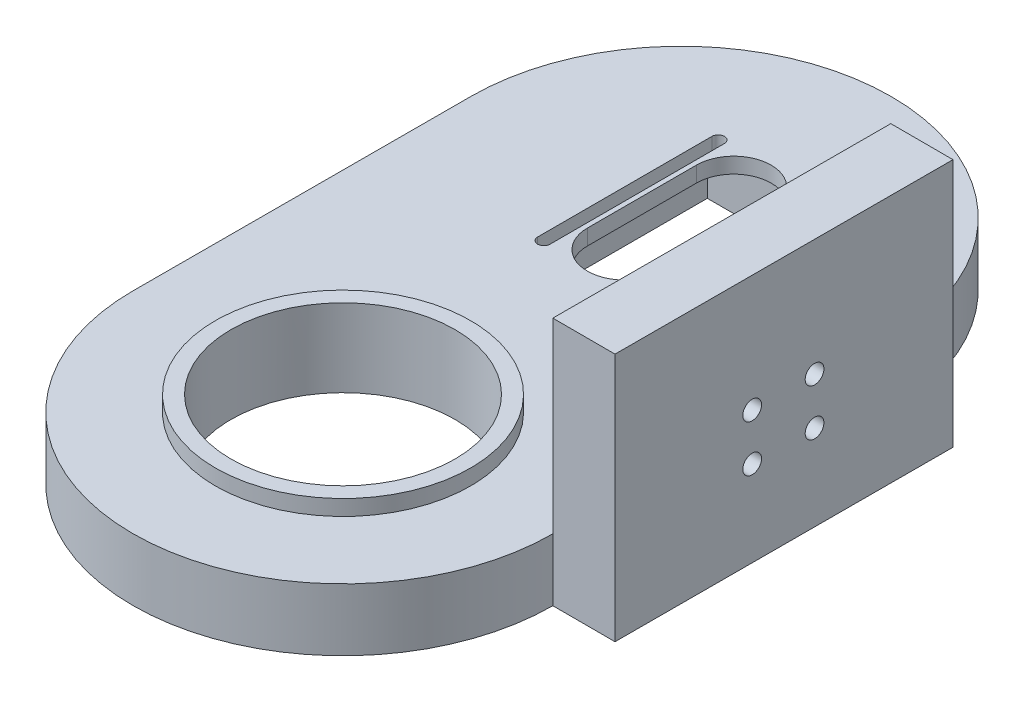
ISO-10303-21;
HEADER;
FILE_DESCRIPTION(('STEP AP214'),'2;1');
FILE_NAME('part.step','',(''),(''),'','','');
FILE_SCHEMA(('AUTOMOTIVE_DESIGN { 1 0 10303 214 1 1 1 1 }'));
ENDSEC;
DATA;
#1=APPLICATION_CONTEXT('core data for automotive mechanical design processes');
#2=APPLICATION_PROTOCOL_DEFINITION('international standard','automotive_design',2000,#1);
#3=PRODUCT_CONTEXT('',#1,'mechanical');
#4=PRODUCT('Part','Part','',(#3));
#5=PRODUCT_RELATED_PRODUCT_CATEGORY('part','',(#4));
#6=PRODUCT_DEFINITION_FORMATION('','',#4);
#7=PRODUCT_DEFINITION_CONTEXT('part definition',#1,'design');
#8=PRODUCT_DEFINITION('design','',#6,#7);
#9=PRODUCT_DEFINITION_SHAPE('','',#8);
#10=(LENGTH_UNIT() NAMED_UNIT(*) SI_UNIT(.MILLI.,.METRE.));
#11=(NAMED_UNIT(*) PLANE_ANGLE_UNIT() SI_UNIT($,.RADIAN.));
#12=(NAMED_UNIT(*) SI_UNIT($,.STERADIAN.) SOLID_ANGLE_UNIT());
#13=UNCERTAINTY_MEASURE_WITH_UNIT(LENGTH_MEASURE(1.E-05),#10,'distance_accuracy_value','');
#14=(GEOMETRIC_REPRESENTATION_CONTEXT(3) GLOBAL_UNCERTAINTY_ASSIGNED_CONTEXT((#13)) GLOBAL_UNIT_ASSIGNED_CONTEXT((#10,
#11,#12)) REPRESENTATION_CONTEXT('',''));
#15=CARTESIAN_POINT('',(0.,0.,0.));
#16=DIRECTION('',(0.,0.,1.));
#17=DIRECTION('',(1.,0.,0.));
#18=AXIS2_PLACEMENT_3D('',#15,#16,#17);
#19=CARTESIAN_POINT('',(0.,20.,0.));
#20=DIRECTION('',(0.,1.,0.));
#21=DIRECTION('',(0.,0.,1.));
#22=AXIS2_PLACEMENT_3D('',#19,#20,#21);
#23=PLANE('',#22);
#24=DIRECTION('',(-0.00171134802945728,0.,0.999998535642889));
#25=VECTOR('',#24,1.);
#26=CARTESIAN_POINT('',(-87.4219763603428,20.,-0.149609646057483));
#27=LINE('',#26,#25);
#28=CARTESIAN_POINT('',(-87.314456968046,20.,-62.9768271373472));
#29=VERTEX_POINT('',#28);
#30=CARTESIAN_POINT('',(-87.4999011558999,20.,45.3844840076296));
#31=VERTEX_POINT('',#30);
#32=EDGE_CURVE('E345',#29,#31,#27,.T.);
#33=ORIENTED_EDGE('',*,*,#32,.T.);
#34=CARTESIAN_POINT('',(-20.0000000000049,20.,45.4999999996179));
#35=DIRECTION('',(0.,1.,0.));
#36=DIRECTION('',(0.,0.,1.));
#37=AXIS2_PLACEMENT_3D('',#34,#35,#36);
#38=CIRCLE('',#37,67.5);
#39=CARTESIAN_POINT('',(47.4999011558901,20.,45.6155159916063));
#40=VERTEX_POINT('',#39);
#41=EDGE_CURVE('E348',#31,#40,#38,.T.);
#42=ORIENTED_EDGE('',*,*,#41,.T.);
#43=DIRECTION('',(0.00171134802945721,0.,-0.999998535642889));
#44=VECTOR('',#43,1.);
#45=CARTESIAN_POINT('',(47.5778259514472,20.,0.0814223379192467));
#46=LINE('',#45,#44);
#47=CARTESIAN_POINT('',(47.6853453437439,20.,-62.7457951533704));
#48=VERTEX_POINT('',#47);
#49=EDGE_CURVE('E351',#40,#48,#46,.T.);
#50=ORIENTED_EDGE('',*,*,#49,.T.);
#51=CARTESIAN_POINT('',(-19.814555812151,20.,-62.8613111453587));
#52=DIRECTION('',(0.,1.,0.));
#53=DIRECTION('',(0.,0.,1.));
#54=AXIS2_PLACEMENT_3D('',#51,#52,#53);
#55=CIRCLE('',#54,67.5);
#56=EDGE_CURVE('E353',#48,#29,#55,.T.);
#57=ORIENTED_EDGE('',*,*,#56,.T.);
#58=EDGE_LOOP('',(#33,#42,#50,#57));
#59=FACE_BOUND('',#58,.T.);
#60=CARTESIAN_POINT('',(-4.5,20.,-90.5));
#61=DIRECTION('',(0.,1.,0.));
#62=DIRECTION('',(0.,0.,1.));
#63=AXIS2_PLACEMENT_3D('',#60,#61,#62);
#64=CIRCLE('',#63,1.99999999999997);
#65=CARTESIAN_POINT('',(-2.50000000000003,20.,-90.5));
#66=VERTEX_POINT('',#65);
#67=CARTESIAN_POINT('',(-6.49999999999998,20.,-90.5));
#68=VERTEX_POINT('',#67);
#69=EDGE_CURVE('E378',#66,#68,#64,.T.);
#70=ORIENTED_EDGE('',*,*,#69,.F.);
#71=DIRECTION('',(0.,0.,1.));
#72=VECTOR('',#71,1.);
#73=CARTESIAN_POINT('',(-2.50000000000003,20.,0.));
#74=LINE('',#73,#72);
#75=CARTESIAN_POINT('',(-2.50000000000003,20.,-34.5));
#76=VERTEX_POINT('',#75);
#77=EDGE_CURVE('E370',#66,#76,#74,.T.);
#78=ORIENTED_EDGE('',*,*,#77,.T.);
#79=CARTESIAN_POINT('',(-4.5,20.,-34.5));
#80=DIRECTION('',(0.,1.,0.));
#81=DIRECTION('',(0.,0.,1.));
#82=AXIS2_PLACEMENT_3D('',#79,#80,#81);
#83=CIRCLE('',#82,1.99999999999997);
#84=CARTESIAN_POINT('',(-6.49999999999998,20.,-34.5));
#85=VERTEX_POINT('',#84);
#86=EDGE_CURVE('E373',#85,#76,#83,.T.);
#87=ORIENTED_EDGE('',*,*,#86,.F.);
#88=DIRECTION('',(0.,0.,1.));
#89=VECTOR('',#88,1.);
#90=CARTESIAN_POINT('',(-6.49999999999998,20.,0.));
#91=LINE('',#90,#89);
#92=EDGE_CURVE('E376',#68,#85,#91,.T.);
#93=ORIENTED_EDGE('',*,*,#92,.F.);
#94=EDGE_LOOP('',(#70,#78,#87,#93));
#95=FACE_BOUND('',#94,.T.);
#96=DIRECTION('',(0.,0.,1.));
#97=VECTOR('',#96,1.);
#98=CARTESIAN_POINT('',(-32.,20.,0.));
#99=LINE('',#98,#97);
#100=CARTESIAN_POINT('',(-32.,20.,-80.));
#101=VERTEX_POINT('',#100);
#102=CARTESIAN_POINT('',(-32.,20.,-45.));
#103=VERTEX_POINT('',#102);
#104=EDGE_CURVE('E387',#101,#103,#99,.T.);
#105=ORIENTED_EDGE('',*,*,#104,.F.);
#106=CARTESIAN_POINT('',(-20.,20.,-80.));
#107=DIRECTION('',(0.,1.,0.));
#108=DIRECTION('',(0.,0.,1.));
#109=AXIS2_PLACEMENT_3D('',#106,#107,#108);
#110=CIRCLE('',#109,12.);
#111=CARTESIAN_POINT('',(-8.00000000000001,20.,-80.));
#112=VERTEX_POINT('',#111);
#113=EDGE_CURVE('E380',#112,#101,#110,.T.);
#114=ORIENTED_EDGE('',*,*,#113,.F.);
#115=DIRECTION('',(0.,0.,1.));
#116=VECTOR('',#115,1.);
#117=CARTESIAN_POINT('',(-8.00000000000001,20.,0.));
#118=LINE('',#117,#116);
#119=CARTESIAN_POINT('',(-8.00000000000001,20.,-45.));
#120=VERTEX_POINT('',#119);
#121=EDGE_CURVE('E382',#112,#120,#118,.T.);
#122=ORIENTED_EDGE('',*,*,#121,.T.);
#123=CARTESIAN_POINT('',(-20.,20.,-45.));
#124=DIRECTION('',(0.,1.,0.));
#125=DIRECTION('',(0.,0.,1.));
#126=AXIS2_PLACEMENT_3D('',#123,#124,#125);
#127=CIRCLE('',#126,12.);
#128=EDGE_CURVE('E385',#103,#120,#127,.T.);
#129=ORIENTED_EDGE('',*,*,#128,.F.);
#130=EDGE_LOOP('',(#105,#114,#122,#129));
#131=FACE_BOUND('',#130,.T.);
#132=CARTESIAN_POINT('',(-35.5,20.,-90.5));
#133=DIRECTION('',(0.,1.,0.));
#134=DIRECTION('',(0.,0.,1.));
#135=AXIS2_PLACEMENT_3D('',#132,#133,#134);
#136=CIRCLE('',#135,2.);
#137=CARTESIAN_POINT('',(-33.5,20.,-90.5));
#138=VERTEX_POINT('',#137);
#139=CARTESIAN_POINT('',(-37.5,20.,-90.5));
#140=VERTEX_POINT('',#139);
#141=EDGE_CURVE('E11',#138,#140,#136,.T.);
#142=ORIENTED_EDGE('',*,*,#141,.F.);
#143=DIRECTION('',(0.,0.,1.));
#144=VECTOR('',#143,1.);
#145=CARTESIAN_POINT('',(-33.5,20.,0.));
#146=LINE('',#145,#144);
#147=CARTESIAN_POINT('',(-33.5,20.,-34.5));
#148=VERTEX_POINT('',#147);
#149=EDGE_CURVE('E389',#138,#148,#146,.T.);
#150=ORIENTED_EDGE('',*,*,#149,.T.);
#151=CARTESIAN_POINT('',(-35.5,20.,-34.5));
#152=DIRECTION('',(0.,1.,0.));
#153=DIRECTION('',(0.,0.,1.));
#154=AXIS2_PLACEMENT_3D('',#151,#152,#153);
#155=CIRCLE('',#154,2.);
#156=CARTESIAN_POINT('',(-37.5,20.,-34.5));
#157=VERTEX_POINT('',#156);
#158=EDGE_CURVE('E392',#157,#148,#155,.T.);
#159=ORIENTED_EDGE('',*,*,#158,.F.);
#160=DIRECTION('',(0.,0.,1.));
#161=VECTOR('',#160,1.);
#162=CARTESIAN_POINT('',(-37.5,20.,0.));
#163=LINE('',#162,#161);
#164=EDGE_CURVE('E44',#140,#157,#163,.T.);
#165=ORIENTED_EDGE('',*,*,#164,.F.);
#166=EDGE_LOOP('',(#142,#150,#159,#165));
#167=FACE_BOUND('',#166,.T.);
#168=CARTESIAN_POINT('',(-20.,20.,45.5));
#169=DIRECTION('',(0.,1.,0.));
#170=DIRECTION('',(0.,0.,1.));
#171=AXIS2_PLACEMENT_3D('',#168,#169,#170);
#172=CIRCLE('',#171,41.);
#173=CARTESIAN_POINT('',(-20.,20.,86.5));
#174=VERTEX_POINT('',#173);
#175=EDGE_CURVE('E235',#174,#174,#172,.T.);
#176=ORIENTED_EDGE('',*,*,#175,.F.);
#177=EDGE_LOOP('',(#176));
#178=FACE_BOUND('',#177,.T.);
#179=ADVANCED_FACE('F36',(#59,#95,#131,#167,#178),#23,.T.);
#180=CARTESIAN_POINT('',(0.,15.,0.));
#181=DIRECTION('',(0.,-1.,0.));
#182=DIRECTION('',(0.,0.,-1.));
#183=AXIS2_PLACEMENT_3D('',#180,#181,#182);
#184=PLANE('',#183);
#185=CARTESIAN_POINT('',(-35.5,15.,-90.5));
#186=DIRECTION('',(0.,-1.,0.));
#187=DIRECTION('',(0.,0.,-1.));
#188=AXIS2_PLACEMENT_3D('',#185,#186,#187);
#189=CIRCLE('',#188,2.);
#190=CARTESIAN_POINT('',(-37.5,15.,-90.5));
#191=VERTEX_POINT('',#190);
#192=CARTESIAN_POINT('',(-35.5,15.,-92.5));
#193=VERTEX_POINT('',#192);
#194=EDGE_CURVE('E250',#191,#193,#189,.T.);
#195=ORIENTED_EDGE('',*,*,#194,.F.);
#196=DIRECTION('',(0.,0.,-1.));
#197=VECTOR('',#196,1.);
#198=CARTESIAN_POINT('',(-37.5,15.,0.));
#199=LINE('',#198,#197);
#200=CARTESIAN_POINT('',(-37.5,15.,-34.5));
#201=VERTEX_POINT('',#200);
#202=EDGE_CURVE('E258',#201,#191,#199,.T.);
#203=ORIENTED_EDGE('',*,*,#202,.F.);
#204=CARTESIAN_POINT('',(-35.5,15.,-34.5));
#205=DIRECTION('',(0.,-1.,0.));
#206=DIRECTION('',(0.,0.,-1.));
#207=AXIS2_PLACEMENT_3D('',#204,#205,#206);
#208=CIRCLE('',#207,2.);
#209=CARTESIAN_POINT('',(-35.5,15.,-32.5));
#210=VERTEX_POINT('',#209);
#211=EDGE_CURVE('E51',#210,#201,#208,.T.);
#212=ORIENTED_EDGE('',*,*,#211,.F.);
#213=DIRECTION('',(-1.,0.,0.));
#214=VECTOR('',#213,1.);
#215=CARTESIAN_POINT('',(0.,15.,-32.5));
#216=LINE('',#215,#214);
#217=CARTESIAN_POINT('',(-41.,15.,-32.5));
#218=VERTEX_POINT('',#217);
#219=EDGE_CURVE('E315',#210,#218,#216,.T.);
#220=ORIENTED_EDGE('',*,*,#219,.T.);
#221=DIRECTION('',(0.,0.,-1.));
#222=VECTOR('',#221,1.);
#223=CARTESIAN_POINT('',(-41.,15.,0.));
#224=LINE('',#223,#222);
#225=CARTESIAN_POINT('',(-41.,15.,-92.5));
#226=VERTEX_POINT('',#225);
#227=EDGE_CURVE('E313',#218,#226,#224,.T.);
#228=ORIENTED_EDGE('',*,*,#227,.T.);
#229=DIRECTION('',(-1.,0.,0.));
#230=VECTOR('',#229,1.);
#231=CARTESIAN_POINT('',(0.,15.,-92.5));
#232=LINE('',#231,#230);
#233=EDGE_CURVE('E318',#193,#226,#232,.T.);
#234=ORIENTED_EDGE('',*,*,#233,.F.);
#235=EDGE_LOOP('',(#195,#203,#212,#220,#228,#234));
#236=FACE_BOUND('',#235,.T.);
#237=ADVANCED_FACE('F421',(#236),#184,.T.);
#238=CARTESIAN_POINT('',(-33.5,15.,-90.5));
#239=VERTEX_POINT('',#238);
#240=EDGE_CURVE('E253',#193,#239,#189,.T.);
#241=ORIENTED_EDGE('',*,*,#240,.F.);
#242=CARTESIAN_POINT('',(-4.5,15.,-92.5));
#243=VERTEX_POINT('',#242);
#244=EDGE_CURVE('E323',#243,#193,#232,.T.);
#245=ORIENTED_EDGE('',*,*,#244,.F.);
#246=CARTESIAN_POINT('',(-4.5,15.,-90.5));
#247=DIRECTION('',(0.,-1.,0.));
#248=DIRECTION('',(0.,0.,-1.));
#249=AXIS2_PLACEMENT_3D('',#246,#247,#248);
#250=CIRCLE('',#249,1.99999999999997);
#251=CARTESIAN_POINT('',(-6.49999999999998,15.,-90.5));
#252=VERTEX_POINT('',#251);
#253=EDGE_CURVE('E290',#252,#243,#250,.T.);
#254=ORIENTED_EDGE('',*,*,#253,.F.);
#255=DIRECTION('',(0.,0.,-1.));
#256=VECTOR('',#255,1.);
#257=CARTESIAN_POINT('',(-6.49999999999998,15.,0.));
#258=LINE('',#257,#256);
#259=CARTESIAN_POINT('',(-6.49999999999998,15.,-34.5));
#260=VERTEX_POINT('',#259);
#261=EDGE_CURVE('E298',#260,#252,#258,.T.);
#262=ORIENTED_EDGE('',*,*,#261,.F.);
#263=CARTESIAN_POINT('',(-4.5,15.,-34.5));
#264=DIRECTION('',(0.,-1.,0.));
#265=DIRECTION('',(0.,0.,-1.));
#266=AXIS2_PLACEMENT_3D('',#263,#264,#265);
#267=CIRCLE('',#266,1.99999999999997);
#268=CARTESIAN_POINT('',(-4.5,15.,-32.5));
#269=VERTEX_POINT('',#268);
#270=EDGE_CURVE('E295',#269,#260,#267,.T.);
#271=ORIENTED_EDGE('',*,*,#270,.F.);
#272=EDGE_CURVE('E314',#269,#210,#216,.T.);
#273=ORIENTED_EDGE('',*,*,#272,.T.);
#274=CARTESIAN_POINT('',(-33.5,15.,-34.5));
#275=VERTEX_POINT('',#274);
#276=EDGE_CURVE('E256',#275,#210,#208,.T.);
#277=ORIENTED_EDGE('',*,*,#276,.F.);
#278=DIRECTION('',(0.,0.,-1.));
#279=VECTOR('',#278,1.);
#280=CARTESIAN_POINT('',(-33.5,15.,0.));
#281=LINE('',#280,#279);
#282=EDGE_CURVE('E252',#275,#239,#281,.T.);
#283=ORIENTED_EDGE('',*,*,#282,.T.);
#284=EDGE_LOOP('',(#241,#245,#254,#262,#271,#273,#277,#283));
#285=FACE_BOUND('',#284,.T.);
#286=DIRECTION('',(0.,0.,-1.));
#287=VECTOR('',#286,1.);
#288=CARTESIAN_POINT('',(-32.,15.,0.));
#289=LINE('',#288,#287);
#290=CARTESIAN_POINT('',(-32.,15.,-45.));
#291=VERTEX_POINT('',#290);
#292=CARTESIAN_POINT('',(-32.,15.,-80.));
#293=VERTEX_POINT('',#292);
#294=EDGE_CURVE('E271',#291,#293,#289,.T.);
#295=ORIENTED_EDGE('',*,*,#294,.F.);
#296=CARTESIAN_POINT('',(-20.,15.,-45.));
#297=DIRECTION('',(0.,-1.,0.));
#298=DIRECTION('',(0.,0.,-1.));
#299=AXIS2_PLACEMENT_3D('',#296,#297,#298);
#300=CIRCLE('',#299,12.);
#301=CARTESIAN_POINT('',(-8.00000000000001,15.,-45.));
#302=VERTEX_POINT('',#301);
#303=EDGE_CURVE('E279',#302,#291,#300,.T.);
#304=ORIENTED_EDGE('',*,*,#303,.F.);
#305=DIRECTION('',(0.,0.,-1.));
#306=VECTOR('',#305,1.);
#307=CARTESIAN_POINT('',(-8.00000000000001,15.,0.));
#308=LINE('',#307,#306);
#309=CARTESIAN_POINT('',(-8.00000000000001,15.,-80.));
#310=VERTEX_POINT('',#309);
#311=EDGE_CURVE('E59',#302,#310,#308,.T.);
#312=ORIENTED_EDGE('',*,*,#311,.T.);
#313=CARTESIAN_POINT('',(-20.,15.,-80.));
#314=DIRECTION('',(0.,-1.,0.));
#315=DIRECTION('',(0.,0.,-1.));
#316=AXIS2_PLACEMENT_3D('',#313,#314,#315);
#317=CIRCLE('',#316,12.);
#318=EDGE_CURVE('E274',#293,#310,#317,.T.);
#319=ORIENTED_EDGE('',*,*,#318,.F.);
#320=EDGE_LOOP('',(#295,#304,#312,#319));
#321=FACE_BOUND('',#320,.T.);
#322=ADVANCED_FACE('F415',(#285,#321),#184,.T.);
#323=CARTESIAN_POINT('',(-87.4219763603428,20.,-0.149609646057483));
#324=DIRECTION('',(0.999998535642889,0.,0.00171134802945728));
#325=DIRECTION('',(0.00171134802945728,0.,-0.999998535642889));
#326=AXIS2_PLACEMENT_3D('',#323,#324,#325);
#327=PLANE('',#326);
#328=DIRECTION('',(-0.00171134802945728,0.,0.999998535642889));
#329=VECTOR('',#328,1.);
#330=CARTESIAN_POINT('',(-87.4219763603428,0.,-0.149609646057483));
#331=LINE('',#330,#329);
#332=CARTESIAN_POINT('',(-87.314456968046,0.,-62.9768271373472));
#333=VERTEX_POINT('',#332);
#334=CARTESIAN_POINT('',(-87.4999011558999,0.,45.3844840076296));
#335=VERTEX_POINT('',#334);
#336=EDGE_CURVE('E338',#333,#335,#331,.T.);
#337=ORIENTED_EDGE('',*,*,#336,.T.);
#338=DIRECTION('',(0.,-1.,0.));
#339=VECTOR('',#338,1.);
#340=CARTESIAN_POINT('',(-87.4999011558999,20.,45.3844840076296));
#341=LINE('',#340,#339);
#342=EDGE_CURVE('E367',#31,#335,#341,.T.);
#343=ORIENTED_EDGE('',*,*,#342,.F.);
#344=ORIENTED_EDGE('',*,*,#32,.F.);
#345=DIRECTION('',(0.,-1.,0.));
#346=VECTOR('',#345,1.);
#347=CARTESIAN_POINT('',(-87.314456968046,20.,-62.9768271373472));
#348=LINE('',#347,#346);
#349=EDGE_CURVE('E355',#29,#333,#348,.T.);
#350=ORIENTED_EDGE('',*,*,#349,.T.);
#351=EDGE_LOOP('',(#337,#343,#344,#350));
#352=FACE_BOUND('',#351,.T.);
#353=ADVANCED_FACE('F38',(#352),#327,.F.);
#354=CARTESIAN_POINT('',(-20.0000000000049,20.,45.4999999996179));
#355=DIRECTION('',(0.,-1.,0.));
#356=DIRECTION('',(0.,0.,-1.));
#357=AXIS2_PLACEMENT_3D('',#354,#355,#356);
#358=CYLINDRICAL_SURFACE('',#357,67.5);
#359=CARTESIAN_POINT('',(-20.0000000000049,0.,45.4999999996179));
#360=DIRECTION('',(0.,1.,0.));
#361=DIRECTION('',(0.,0.,1.));
#362=AXIS2_PLACEMENT_3D('',#359,#360,#361);
#363=CIRCLE('',#362,67.5);
#364=CARTESIAN_POINT('',(47.4999011558901,0.,45.6155159916063));
#365=VERTEX_POINT('',#364);
#366=EDGE_CURVE('E358',#335,#365,#363,.T.);
#367=ORIENTED_EDGE('',*,*,#366,.T.);
#368=DIRECTION('',(0.,-1.,0.));
#369=VECTOR('',#368,1.);
#370=CARTESIAN_POINT('',(47.4999011558901,20.,45.6155159916063));
#371=LINE('',#370,#369);
#372=EDGE_CURVE('E231',#40,#365,#371,.T.);
#373=ORIENTED_EDGE('',*,*,#372,.F.);
#374=ORIENTED_EDGE('',*,*,#41,.F.);
#375=ORIENTED_EDGE('',*,*,#342,.T.);
#376=EDGE_LOOP('',(#367,#373,#374,#375));
#377=FACE_BOUND('',#376,.T.);
#378=ADVANCED_FACE('F484',(#377),#358,.T.);
#379=CARTESIAN_POINT('',(-19.814555812151,20.,-62.8613111453587));
#380=DIRECTION('',(0.,-1.,0.));
#381=DIRECTION('',(0.,0.,-1.));
#382=AXIS2_PLACEMENT_3D('',#379,#380,#381);
#383=CYLINDRICAL_SURFACE('',#382,67.5);
#384=CARTESIAN_POINT('',(-19.814555812151,0.,-62.8613111453587));
#385=DIRECTION('',(0.,1.,0.));
#386=DIRECTION('',(0.,0.,1.));
#387=AXIS2_PLACEMENT_3D('',#384,#385,#386);
#388=CIRCLE('',#387,67.5);
#389=CARTESIAN_POINT('',(47.685345343744,0.,-62.7457951533704));
#390=VERTEX_POINT('',#389);
#391=EDGE_CURVE('E349',#390,#333,#388,.T.);
#392=ORIENTED_EDGE('',*,*,#391,.T.);
#393=ORIENTED_EDGE('',*,*,#349,.F.);
#394=ORIENTED_EDGE('',*,*,#56,.F.);
#395=DIRECTION('',(0.,-1.,0.));
#396=VECTOR('',#395,1.);
#397=CARTESIAN_POINT('',(47.6853453437439,20.,-62.7457951533704));
#398=LINE('',#397,#396);
#399=EDGE_CURVE('E363',#48,#390,#398,.T.);
#400=ORIENTED_EDGE('',*,*,#399,.T.);
#401=EDGE_LOOP('',(#392,#393,#394,#400));
#402=FACE_BOUND('',#401,.T.);
#403=ADVANCED_FACE('F481',(#402),#383,.T.);
#404=CARTESIAN_POINT('',(0.,0.,0.));
#405=DIRECTION('',(0.,1.,0.));
#406=DIRECTION('',(0.,0.,1.));
#407=AXIS2_PLACEMENT_3D('',#404,#405,#406);
#408=PLANE('',#407);
#409=CARTESIAN_POINT('',(-20.,0.,45.5));
#410=DIRECTION('',(0.,-1.,0.));
#411=DIRECTION('',(0.,0.,-1.));
#412=AXIS2_PLACEMENT_3D('',#409,#410,#411);
#413=CIRCLE('',#412,36.);
#414=CARTESIAN_POINT('',(-20.,0.,9.50000000000002));
#415=VERTEX_POINT('',#414);
#416=EDGE_CURVE('E244',#415,#415,#413,.T.);
#417=ORIENTED_EDGE('',*,*,#416,.F.);
#418=EDGE_LOOP('',(#417));
#419=FACE_BOUND('',#418,.T.);
#420=DIRECTION('',(0.,0.,-1.));
#421=VECTOR('',#420,1.);
#422=CARTESIAN_POINT('',(-41.,0.,0.));
#423=LINE('',#422,#421);
#424=CARTESIAN_POINT('',(-41.,0.,-32.5));
#425=VERTEX_POINT('',#424);
#426=CARTESIAN_POINT('',(-41.,0.,-92.5));
#427=VERTEX_POINT('',#426);
#428=EDGE_CURVE('E327',#425,#427,#423,.T.);
#429=ORIENTED_EDGE('',*,*,#428,.F.);
#430=DIRECTION('',(-1.,0.,0.));
#431=VECTOR('',#430,1.);
#432=CARTESIAN_POINT('',(0.,0.,-32.5));
#433=LINE('',#432,#431);
#434=CARTESIAN_POINT('',(0.999999999999973,0.,-32.5));
#435=VERTEX_POINT('',#434);
#436=EDGE_CURVE('E264',#435,#425,#433,.T.);
#437=ORIENTED_EDGE('',*,*,#436,.F.);
#438=DIRECTION('',(0.,0.,-1.));
#439=VECTOR('',#438,1.);
#440=CARTESIAN_POINT('',(0.99999999999997,0.,0.));
#441=LINE('',#440,#439);
#442=CARTESIAN_POINT('',(0.999999999999978,0.,-92.5));
#443=VERTEX_POINT('',#442);
#444=EDGE_CURVE('E333',#435,#443,#441,.T.);
#445=ORIENTED_EDGE('',*,*,#444,.T.);
#446=DIRECTION('',(-1.,0.,0.));
#447=VECTOR('',#446,1.);
#448=CARTESIAN_POINT('',(0.,0.,-92.5));
#449=LINE('',#448,#447);
#450=EDGE_CURVE('E330',#443,#427,#449,.T.);
#451=ORIENTED_EDGE('',*,*,#450,.T.);
#452=EDGE_LOOP('',(#429,#437,#445,#451));
#453=FACE_BOUND('',#452,.T.);
#454=ORIENTED_EDGE('',*,*,#336,.F.);
#455=ORIENTED_EDGE('',*,*,#391,.F.);
#456=DIRECTION('',(-0.999998535642889,0.,-0.00171134802945721));
#457=VECTOR('',#456,1.);
#458=CARTESIAN_POINT('',(67.6853160566017,0.,-62.7115681927812));
#459=LINE('',#458,#457);
#460=CARTESIAN_POINT('',(67.6853160566017,0.,-62.7115681927812));
#461=VERTEX_POINT('',#460);
#462=EDGE_CURVE('E211',#461,#390,#459,.T.);
#463=ORIENTED_EDGE('',*,*,#462,.F.);
#464=DIRECTION('',(0.00171134802945722,0.,-0.999998535642889));
#465=VECTOR('',#464,1.);
#466=CARTESIAN_POINT('',(67.6853160566017,0.,-62.7115681927812));
#467=LINE('',#466,#465);
#468=CARTESIAN_POINT('',(67.4998718687479,0.,45.6497429521954));
#469=VERTEX_POINT('',#468);
#470=EDGE_CURVE('E204',#469,#461,#467,.T.);
#471=ORIENTED_EDGE('',*,*,#470,.F.);
#472=DIRECTION('',(-0.999998535642889,0.,-0.00171134802945721));
#473=VECTOR('',#472,1.);
#474=CARTESIAN_POINT('',(67.4998718687479,0.,45.6497429521954));
#475=LINE('',#474,#473);
#476=EDGE_CURVE('E209',#469,#365,#475,.T.);
#477=ORIENTED_EDGE('',*,*,#476,.T.);
#478=ORIENTED_EDGE('',*,*,#366,.F.);
#479=EDGE_LOOP('',(#454,#455,#463,#471,#477,#478));
#480=FACE_BOUND('',#479,.T.);
#481=ADVANCED_FACE('F207',(#419,#453,#480),#408,.F.);
#482=CARTESIAN_POINT('',(0.,15.,-32.5));
#483=DIRECTION('',(0.,0.,1.));
#484=DIRECTION('',(1.,0.,0.));
#485=AXIS2_PLACEMENT_3D('',#482,#483,#484);
#486=PLANE('',#485);
#487=ORIENTED_EDGE('',*,*,#436,.T.);
#488=DIRECTION('',(0.,-1.,0.));
#489=VECTOR('',#488,1.);
#490=CARTESIAN_POINT('',(-41.,15.,-32.5));
#491=LINE('',#490,#489);
#492=EDGE_CURVE('E325',#218,#425,#491,.T.);
#493=ORIENTED_EDGE('',*,*,#492,.F.);
#494=ORIENTED_EDGE('',*,*,#219,.F.);
#495=ORIENTED_EDGE('',*,*,#272,.F.);
#496=CARTESIAN_POINT('',(0.999999999999973,15.,-32.5));
#497=VERTEX_POINT('',#496);
#498=EDGE_CURVE('E310',#497,#269,#216,.T.);
#499=ORIENTED_EDGE('',*,*,#498,.F.);
#500=DIRECTION('',(0.,-1.,0.));
#501=VECTOR('',#500,1.);
#502=CARTESIAN_POINT('',(0.999999999999973,15.,-32.5));
#503=LINE('',#502,#501);
#504=EDGE_CURVE('E336',#497,#435,#503,.T.);
#505=ORIENTED_EDGE('',*,*,#504,.T.);
#506=EDGE_LOOP('',(#487,#493,#494,#495,#499,#505));
#507=FACE_BOUND('',#506,.T.);
#508=ADVANCED_FACE('F457',(#507),#486,.F.);
#509=CARTESIAN_POINT('',(0.99999999999997,15.,0.));
#510=DIRECTION('',(-1.,0.,0.));
#511=DIRECTION('',(0.,0.,1.));
#512=AXIS2_PLACEMENT_3D('',#509,#510,#511);
#513=PLANE('',#512);
#514=ORIENTED_EDGE('',*,*,#444,.F.);
#515=ORIENTED_EDGE('',*,*,#504,.F.);
#516=DIRECTION('',(0.,0.,-1.));
#517=VECTOR('',#516,1.);
#518=CARTESIAN_POINT('',(0.99999999999997,15.,0.));
#519=LINE('',#518,#517);
#520=CARTESIAN_POINT('',(0.999999999999978,15.,-92.5));
#521=VERTEX_POINT('',#520);
#522=EDGE_CURVE('E322',#497,#521,#519,.T.);
#523=ORIENTED_EDGE('',*,*,#522,.T.);
#524=DIRECTION('',(0.,-1.,0.));
#525=VECTOR('',#524,1.);
#526=CARTESIAN_POINT('',(0.999999999999978,15.,-92.5));
#527=LINE('',#526,#525);
#528=EDGE_CURVE('E339',#521,#443,#527,.T.);
#529=ORIENTED_EDGE('',*,*,#528,.T.);
#530=EDGE_LOOP('',(#514,#515,#523,#529));
#531=FACE_BOUND('',#530,.T.);
#532=ADVANCED_FACE('F632',(#531),#513,.T.);
#533=CARTESIAN_POINT('',(0.,15.,-92.5));
#534=DIRECTION('',(0.,0.,1.));
#535=DIRECTION('',(1.,0.,0.));
#536=AXIS2_PLACEMENT_3D('',#533,#534,#535);
#537=PLANE('',#536);
#538=ORIENTED_EDGE('',*,*,#450,.F.);
#539=ORIENTED_EDGE('',*,*,#528,.F.);
#540=EDGE_CURVE('E319',#521,#243,#232,.T.);
#541=ORIENTED_EDGE('',*,*,#540,.T.);
#542=ORIENTED_EDGE('',*,*,#244,.T.);
#543=ORIENTED_EDGE('',*,*,#233,.T.);
#544=DIRECTION('',(0.,-1.,0.));
#545=VECTOR('',#544,1.);
#546=CARTESIAN_POINT('',(-41.,15.,-92.5));
#547=LINE('',#546,#545);
#548=EDGE_CURVE('E341',#226,#427,#547,.T.);
#549=ORIENTED_EDGE('',*,*,#548,.T.);
#550=EDGE_LOOP('',(#538,#539,#541,#542,#543,#549));
#551=FACE_BOUND('',#550,.T.);
#552=ADVANCED_FACE('F426',(#551),#537,.T.);
#553=CARTESIAN_POINT('',(-41.,15.,0.));
#554=DIRECTION('',(-1.,0.,0.));
#555=DIRECTION('',(0.,0.,1.));
#556=AXIS2_PLACEMENT_3D('',#553,#554,#555);
#557=PLANE('',#556);
#558=ORIENTED_EDGE('',*,*,#428,.T.);
#559=ORIENTED_EDGE('',*,*,#548,.F.);
#560=ORIENTED_EDGE('',*,*,#227,.F.);
#561=ORIENTED_EDGE('',*,*,#492,.T.);
#562=EDGE_LOOP('',(#558,#559,#560,#561));
#563=FACE_BOUND('',#562,.T.);
#564=ADVANCED_FACE('F623',(#563),#557,.F.);
#565=CARTESIAN_POINT('',(-2.50000000000003,15.,-90.5));
#566=VERTEX_POINT('',#565);
#567=EDGE_CURVE('E249',#243,#566,#250,.T.);
#568=ORIENTED_EDGE('',*,*,#567,.F.);
#569=ORIENTED_EDGE('',*,*,#540,.F.);
#570=ORIENTED_EDGE('',*,*,#522,.F.);
#571=ORIENTED_EDGE('',*,*,#498,.T.);
#572=CARTESIAN_POINT('',(-2.50000000000003,15.,-34.5));
#573=VERTEX_POINT('',#572);
#574=EDGE_CURVE('E296',#573,#269,#267,.T.);
#575=ORIENTED_EDGE('',*,*,#574,.F.);
#576=DIRECTION('',(0.,0.,-1.));
#577=VECTOR('',#576,1.);
#578=CARTESIAN_POINT('',(-2.50000000000003,15.,0.));
#579=LINE('',#578,#577);
#580=EDGE_CURVE('E292',#573,#566,#579,.T.);
#581=ORIENTED_EDGE('',*,*,#580,.T.);
#582=EDGE_LOOP('',(#568,#569,#570,#571,#575,#581));
#583=FACE_BOUND('',#582,.T.);
#584=ADVANCED_FACE('F432',(#583),#184,.T.);
#585=CARTESIAN_POINT('',(-4.5,35.,-90.5));
#586=DIRECTION('',(0.,-1.,0.));
#587=DIRECTION('',(0.,0.,-1.));
#588=AXIS2_PLACEMENT_3D('',#585,#586,#587);
#589=CYLINDRICAL_SURFACE('',#588,1.99999999999997);
#590=ORIENTED_EDGE('',*,*,#69,.T.);
#591=DIRECTION('',(0.,-1.,0.));
#592=VECTOR('',#591,1.);
#593=CARTESIAN_POINT('',(-6.49999999999998,35.,-90.5));
#594=LINE('',#593,#592);
#595=EDGE_CURVE('E275',#68,#252,#594,.T.);
#596=ORIENTED_EDGE('',*,*,#595,.T.);
#597=ORIENTED_EDGE('',*,*,#253,.T.);
#598=ORIENTED_EDGE('',*,*,#567,.T.);
#599=DIRECTION('',(0.,-1.,0.));
#600=VECTOR('',#599,1.);
#601=CARTESIAN_POINT('',(-2.50000000000003,35.,-90.5));
#602=LINE('',#601,#600);
#603=EDGE_CURVE('E301',#66,#566,#602,.T.);
#604=ORIENTED_EDGE('',*,*,#603,.F.);
#605=EDGE_LOOP('',(#590,#596,#597,#598,#604));
#606=FACE_BOUND('',#605,.T.);
#607=ADVANCED_FACE('F438',(#606),#589,.F.);
#608=CARTESIAN_POINT('',(-6.49999999999998,35.,0.));
#609=DIRECTION('',(-1.,0.,0.));
#610=DIRECTION('',(0.,0.,1.));
#611=AXIS2_PLACEMENT_3D('',#608,#609,#610);
#612=PLANE('',#611);
#613=ORIENTED_EDGE('',*,*,#92,.T.);
#614=DIRECTION('',(0.,-1.,0.));
#615=VECTOR('',#614,1.);
#616=CARTESIAN_POINT('',(-6.49999999999998,35.,-34.5));
#617=LINE('',#616,#615);
#618=EDGE_CURVE('E303',#85,#260,#617,.T.);
#619=ORIENTED_EDGE('',*,*,#618,.T.);
#620=ORIENTED_EDGE('',*,*,#261,.T.);
#621=ORIENTED_EDGE('',*,*,#595,.F.);
#622=EDGE_LOOP('',(#613,#619,#620,#621));
#623=FACE_BOUND('',#622,.T.);
#624=ADVANCED_FACE('F448',(#623),#612,.F.);
#625=CARTESIAN_POINT('',(-4.5,35.,-34.5));
#626=DIRECTION('',(0.,-1.,0.));
#627=DIRECTION('',(0.,0.,-1.));
#628=AXIS2_PLACEMENT_3D('',#625,#626,#627);
#629=CYLINDRICAL_SURFACE('',#628,1.99999999999997);
#630=ORIENTED_EDGE('',*,*,#86,.T.);
#631=DIRECTION('',(0.,-1.,0.));
#632=VECTOR('',#631,1.);
#633=CARTESIAN_POINT('',(-2.50000000000003,35.,-34.5));
#634=LINE('',#633,#632);
#635=EDGE_CURVE('E306',#76,#573,#634,.T.);
#636=ORIENTED_EDGE('',*,*,#635,.T.);
#637=ORIENTED_EDGE('',*,*,#574,.T.);
#638=ORIENTED_EDGE('',*,*,#270,.T.);
#639=ORIENTED_EDGE('',*,*,#618,.F.);
#640=EDGE_LOOP('',(#630,#636,#637,#638,#639));
#641=FACE_BOUND('',#640,.T.);
#642=ADVANCED_FACE('F459',(#641),#629,.F.);
#643=CARTESIAN_POINT('',(-2.50000000000003,35.,0.));
#644=DIRECTION('',(-1.,0.,0.));
#645=DIRECTION('',(0.,0.,1.));
#646=AXIS2_PLACEMENT_3D('',#643,#644,#645);
#647=PLANE('',#646);
#648=ORIENTED_EDGE('',*,*,#603,.T.);
#649=ORIENTED_EDGE('',*,*,#580,.F.);
#650=ORIENTED_EDGE('',*,*,#635,.F.);
#651=ORIENTED_EDGE('',*,*,#77,.F.);
#652=EDGE_LOOP('',(#648,#649,#650,#651));
#653=FACE_BOUND('',#652,.T.);
#654=ADVANCED_FACE('F441',(#653),#647,.T.);
#655=CARTESIAN_POINT('',(-32.,35.,0.));
#656=DIRECTION('',(-1.,0.,0.));
#657=DIRECTION('',(0.,0.,1.));
#658=AXIS2_PLACEMENT_3D('',#655,#656,#657);
#659=PLANE('',#658);
#660=ORIENTED_EDGE('',*,*,#104,.T.);
#661=DIRECTION('',(0.,-1.,0.));
#662=VECTOR('',#661,1.);
#663=CARTESIAN_POINT('',(-32.,35.,-45.));
#664=LINE('',#663,#662);
#665=EDGE_CURVE('E283',#103,#291,#664,.T.);
#666=ORIENTED_EDGE('',*,*,#665,.T.);
#667=ORIENTED_EDGE('',*,*,#294,.T.);
#668=DIRECTION('',(0.,-1.,0.));
#669=VECTOR('',#668,1.);
#670=CARTESIAN_POINT('',(-32.,35.,-80.));
#671=LINE('',#670,#669);
#672=EDGE_CURVE('E282',#101,#293,#671,.T.);
#673=ORIENTED_EDGE('',*,*,#672,.F.);
#674=EDGE_LOOP('',(#660,#666,#667,#673));
#675=FACE_BOUND('',#674,.T.);
#676=ADVANCED_FACE('F466',(#675),#659,.F.);
#677=CARTESIAN_POINT('',(-20.,35.,-45.));
#678=DIRECTION('',(0.,-1.,0.));
#679=DIRECTION('',(0.,0.,-1.));
#680=AXIS2_PLACEMENT_3D('',#677,#678,#679);
#681=CYLINDRICAL_SURFACE('',#680,12.);
#682=ORIENTED_EDGE('',*,*,#128,.T.);
#683=DIRECTION('',(0.,-1.,0.));
#684=VECTOR('',#683,1.);
#685=CARTESIAN_POINT('',(-8.00000000000001,35.,-45.));
#686=LINE('',#685,#684);
#687=EDGE_CURVE('E285',#120,#302,#686,.T.);
#688=ORIENTED_EDGE('',*,*,#687,.T.);
#689=ORIENTED_EDGE('',*,*,#303,.T.);
#690=ORIENTED_EDGE('',*,*,#665,.F.);
#691=EDGE_LOOP('',(#682,#688,#689,#690));
#692=FACE_BOUND('',#691,.T.);
#693=ADVANCED_FACE('F594',(#692),#681,.F.);
#694=CARTESIAN_POINT('',(-8.00000000000001,35.,0.));
#695=DIRECTION('',(-1.,0.,0.));
#696=DIRECTION('',(0.,0.,1.));
#697=AXIS2_PLACEMENT_3D('',#694,#695,#696);
#698=PLANE('',#697);
#699=DIRECTION('',(0.,-1.,0.));
#700=VECTOR('',#699,1.);
#701=CARTESIAN_POINT('',(-8.00000000000001,35.,-80.));
#702=LINE('',#701,#700);
#703=EDGE_CURVE('E287',#112,#310,#702,.T.);
#704=ORIENTED_EDGE('',*,*,#703,.T.);
#705=ORIENTED_EDGE('',*,*,#311,.F.);
#706=ORIENTED_EDGE('',*,*,#687,.F.);
#707=ORIENTED_EDGE('',*,*,#121,.F.);
#708=EDGE_LOOP('',(#704,#705,#706,#707));
#709=FACE_BOUND('',#708,.T.);
#710=ADVANCED_FACE('F597',(#709),#698,.T.);
#711=CARTESIAN_POINT('',(-20.,35.,-80.));
#712=DIRECTION('',(0.,-1.,0.));
#713=DIRECTION('',(0.,0.,-1.));
#714=AXIS2_PLACEMENT_3D('',#711,#712,#713);
#715=CYLINDRICAL_SURFACE('',#714,12.);
#716=ORIENTED_EDGE('',*,*,#113,.T.);
#717=ORIENTED_EDGE('',*,*,#672,.T.);
#718=ORIENTED_EDGE('',*,*,#318,.T.);
#719=ORIENTED_EDGE('',*,*,#703,.F.);
#720=EDGE_LOOP('',(#716,#717,#718,#719));
#721=FACE_BOUND('',#720,.T.);
#722=ADVANCED_FACE('F593',(#721),#715,.F.);
#723=CARTESIAN_POINT('',(-35.5,35.,-90.5));
#724=DIRECTION('',(0.,-1.,0.));
#725=DIRECTION('',(0.,0.,-1.));
#726=AXIS2_PLACEMENT_3D('',#723,#724,#725);
#727=CYLINDRICAL_SURFACE('',#726,2.);
#728=ORIENTED_EDGE('',*,*,#141,.T.);
#729=DIRECTION('',(0.,-1.,0.));
#730=VECTOR('',#729,1.);
#731=CARTESIAN_POINT('',(-37.5,35.,-90.5));
#732=LINE('',#731,#730);
#733=EDGE_CURVE('E262',#140,#191,#732,.T.);
#734=ORIENTED_EDGE('',*,*,#733,.T.);
#735=ORIENTED_EDGE('',*,*,#194,.T.);
#736=ORIENTED_EDGE('',*,*,#240,.T.);
#737=DIRECTION('',(0.,-1.,0.));
#738=VECTOR('',#737,1.);
#739=CARTESIAN_POINT('',(-33.5,35.,-90.5));
#740=LINE('',#739,#738);
#741=EDGE_CURVE('E261',#138,#239,#740,.T.);
#742=ORIENTED_EDGE('',*,*,#741,.F.);
#743=EDGE_LOOP('',(#728,#734,#735,#736,#742));
#744=FACE_BOUND('',#743,.T.);
#745=ADVANCED_FACE('F409',(#744),#727,.F.);
#746=CARTESIAN_POINT('',(-37.5,35.,0.));
#747=DIRECTION('',(-1.,0.,0.));
#748=DIRECTION('',(0.,0.,1.));
#749=AXIS2_PLACEMENT_3D('',#746,#747,#748);
#750=PLANE('',#749);
#751=ORIENTED_EDGE('',*,*,#164,.T.);
#752=DIRECTION('',(0.,-1.,0.));
#753=VECTOR('',#752,1.);
#754=CARTESIAN_POINT('',(-37.5,35.,-34.5));
#755=LINE('',#754,#753);
#756=EDGE_CURVE('E265',#157,#201,#755,.T.);
#757=ORIENTED_EDGE('',*,*,#756,.T.);
#758=ORIENTED_EDGE('',*,*,#202,.T.);
#759=ORIENTED_EDGE('',*,*,#733,.F.);
#760=EDGE_LOOP('',(#751,#757,#758,#759));
#761=FACE_BOUND('',#760,.T.);
#762=ADVANCED_FACE('F397',(#761),#750,.F.);
#763=CARTESIAN_POINT('',(-35.5,35.,-34.5));
#764=DIRECTION('',(0.,-1.,0.));
#765=DIRECTION('',(0.,0.,-1.));
#766=AXIS2_PLACEMENT_3D('',#763,#764,#765);
#767=CYLINDRICAL_SURFACE('',#766,2.);
#768=ORIENTED_EDGE('',*,*,#158,.T.);
#769=DIRECTION('',(0.,-1.,0.));
#770=VECTOR('',#769,1.);
#771=CARTESIAN_POINT('',(-33.5,35.,-34.5));
#772=LINE('',#771,#770);
#773=EDGE_CURVE('E267',#148,#275,#772,.T.);
#774=ORIENTED_EDGE('',*,*,#773,.T.);
#775=ORIENTED_EDGE('',*,*,#276,.T.);
#776=ORIENTED_EDGE('',*,*,#211,.T.);
#777=ORIENTED_EDGE('',*,*,#756,.F.);
#778=EDGE_LOOP('',(#768,#774,#775,#776,#777));
#779=FACE_BOUND('',#778,.T.);
#780=ADVANCED_FACE('F402',(#779),#767,.F.);
#781=CARTESIAN_POINT('',(-33.5,35.,0.));
#782=DIRECTION('',(-1.,0.,0.));
#783=DIRECTION('',(0.,0.,1.));
#784=AXIS2_PLACEMENT_3D('',#781,#782,#783);
#785=PLANE('',#784);
#786=ORIENTED_EDGE('',*,*,#741,.T.);
#787=ORIENTED_EDGE('',*,*,#282,.F.);
#788=ORIENTED_EDGE('',*,*,#773,.F.);
#789=ORIENTED_EDGE('',*,*,#149,.F.);
#790=EDGE_LOOP('',(#786,#787,#788,#789));
#791=FACE_BOUND('',#790,.T.);
#792=ADVANCED_FACE('F406',(#791),#785,.T.);
#793=CARTESIAN_POINT('',(-20.,20.,45.5));
#794=DIRECTION('',(0.,-1.,0.));
#795=DIRECTION('',(0.,0.,-1.));
#796=AXIS2_PLACEMENT_3D('',#793,#794,#795);
#797=CYLINDRICAL_SURFACE('',#796,36.);
#798=ORIENTED_EDGE('',*,*,#416,.T.);
#799=EDGE_LOOP('',(#798));
#800=FACE_BOUND('',#799,.T.);
#801=CARTESIAN_POINT('',(-20.,25.,45.5));
#802=DIRECTION('',(0.,1.,0.));
#803=DIRECTION('',(0.,0.,1.));
#804=AXIS2_PLACEMENT_3D('',#801,#802,#803);
#805=CIRCLE('',#804,36.);
#806=CARTESIAN_POINT('',(-20.,25.,81.5));
#807=VERTEX_POINT('',#806);
#808=EDGE_CURVE('E232',#807,#807,#805,.T.);
#809=ORIENTED_EDGE('',*,*,#808,.T.);
#810=EDGE_LOOP('',(#809));
#811=FACE_BOUND('',#810,.T.);
#812=ADVANCED_FACE('F579',(#800,#811),#797,.F.);
#813=CARTESIAN_POINT('',(-20.,25.,45.5));
#814=DIRECTION('',(0.,1.,0.));
#815=DIRECTION('',(0.,0.,1.));
#816=AXIS2_PLACEMENT_3D('',#813,#814,#815);
#817=PLANE('',#816);
#818=CARTESIAN_POINT('',(-20.,25.,45.5));
#819=DIRECTION('',(0.,1.,0.));
#820=DIRECTION('',(0.,0.,1.));
#821=AXIS2_PLACEMENT_3D('',#818,#819,#820);
#822=CIRCLE('',#821,41.);
#823=CARTESIAN_POINT('',(-20.,25.,86.5));
#824=VERTEX_POINT('',#823);
#825=EDGE_CURVE('E241',#824,#824,#822,.T.);
#826=ORIENTED_EDGE('',*,*,#825,.T.);
#827=EDGE_LOOP('',(#826));
#828=FACE_BOUND('',#827,.T.);
#829=ORIENTED_EDGE('',*,*,#808,.F.);
#830=EDGE_LOOP('',(#829));
#831=FACE_BOUND('',#830,.T.);
#832=ADVANCED_FACE('F565',(#828,#831),#817,.T.);
#833=CARTESIAN_POINT('',(-20.,25.,45.5));
#834=DIRECTION('',(0.,-1.,0.));
#835=DIRECTION('',(0.,0.,-1.));
#836=AXIS2_PLACEMENT_3D('',#833,#834,#835);
#837=CYLINDRICAL_SURFACE('',#836,41.);
#838=ORIENTED_EDGE('',*,*,#825,.F.);
#839=EDGE_LOOP('',(#838));
#840=FACE_BOUND('',#839,.T.);
#841=ORIENTED_EDGE('',*,*,#175,.T.);
#842=EDGE_LOOP('',(#841));
#843=FACE_BOUND('',#842,.T.);
#844=ADVANCED_FACE('F559',(#840,#843),#837,.T.);
#845=CARTESIAN_POINT('',(67.577796664305,0.,0.115649298508391));
#846=DIRECTION('',(0.999998535642889,0.,0.00171134802945722));
#847=DIRECTION('',(0.00171134802945722,0.,-0.999998535642889));
#848=AXIS2_PLACEMENT_3D('',#845,#846,#847);
#849=PLANE('',#848);
#850=CARTESIAN_POINT('',(67.6093686817517,42.5,-18.332948339484));
#851=DIRECTION('',(0.999998535642889,0.,0.00171134802945721));
#852=DIRECTION('',(0.00171134802945721,0.,-0.999998535642889));
#853=AXIS2_PLACEMENT_3D('',#850,#851,#852);
#854=CIRCLE('',#853,3.00000000000001);
#855=CARTESIAN_POINT('',(67.6145027258401,42.5,-21.3329439464127));
#856=VERTEX_POINT('',#855);
#857=EDGE_CURVE('E543',#856,#856,#854,.T.);
#858=ORIENTED_EDGE('',*,*,#857,.F.);
#859=EDGE_LOOP('',(#858));
#860=FACE_BOUND('',#859,.T.);
#861=CARTESIAN_POINT('',(67.5751417211626,27.5,1.66702237337373));
#862=DIRECTION('',(0.999998535642889,0.,0.00171134802945721));
#863=DIRECTION('',(0.00171134802945721,0.,-0.999998535642889));
#864=AXIS2_PLACEMENT_3D('',#861,#862,#863);
#865=CIRCLE('',#864,3.00000000000001);
#866=CARTESIAN_POINT('',(67.5802757652509,27.5,-1.33297323355495));
#867=VERTEX_POINT('',#866);
#868=EDGE_CURVE('E510',#867,#867,#865,.T.);
#869=ORIENTED_EDGE('',*,*,#868,.F.);
#870=EDGE_LOOP('',(#869));
#871=FACE_BOUND('',#870,.T.);
#872=DIRECTION('',(0.,-1.,0.));
#873=VECTOR('',#872,1.);
#874=CARTESIAN_POINT('',(67.4998718687479,0.,45.6497429521954));
#875=LINE('',#874,#873);
#876=CARTESIAN_POINT('',(67.4998718687479,80.,45.6497429521954));
#877=VERTEX_POINT('',#876);
#878=EDGE_CURVE('E215',#877,#469,#875,.T.);
#879=ORIENTED_EDGE('',*,*,#878,.T.);
#880=ORIENTED_EDGE('',*,*,#470,.T.);
#881=DIRECTION('',(0.,1.,0.));
#882=VECTOR('',#881,1.);
#883=CARTESIAN_POINT('',(67.6853160566017,0.,-62.7115681927812));
#884=LINE('',#883,#882);
#885=CARTESIAN_POINT('',(67.6853160566017,80.,-62.7115681927812));
#886=VERTEX_POINT('',#885);
#887=EDGE_CURVE('E214',#461,#886,#884,.T.);
#888=ORIENTED_EDGE('',*,*,#887,.T.);
#889=DIRECTION('',(-0.00171134802945722,0.,0.999998535642889));
#890=VECTOR('',#889,1.);
#891=CARTESIAN_POINT('',(67.6853160566017,80.,-62.7115681927812));
#892=LINE('',#891,#890);
#893=EDGE_CURVE('E221',#886,#877,#892,.T.);
#894=ORIENTED_EDGE('',*,*,#893,.T.);
#895=EDGE_LOOP('',(#879,#880,#888,#894));
#896=FACE_BOUND('',#895,.T.);
#897=CARTESIAN_POINT('',(67.6093686817517,27.5,-18.332948339484));
#898=DIRECTION('',(0.999998535642889,0.,0.00171134802945721));
#899=DIRECTION('',(0.00171134802945721,0.,-0.999998535642889));
#900=AXIS2_PLACEMENT_3D('',#897,#898,#899);
#901=CIRCLE('',#900,3.00000000000001);
#902=CARTESIAN_POINT('',(67.6145027258401,27.5,-21.3329439464127));
#903=VERTEX_POINT('',#902);
#904=EDGE_CURVE('E547',#903,#903,#901,.T.);
#905=ORIENTED_EDGE('',*,*,#904,.F.);
#906=EDGE_LOOP('',(#905));
#907=FACE_BOUND('',#906,.T.);
#908=CARTESIAN_POINT('',(67.5751417211626,42.5,1.66702237337378));
#909=DIRECTION('',(0.999998535642889,0.,0.00171134802945721));
#910=DIRECTION('',(0.00171134802945721,0.,-0.999998535642889));
#911=AXIS2_PLACEMENT_3D('',#908,#909,#910);
#912=CIRCLE('',#911,3.00000000000001);
#913=CARTESIAN_POINT('',(67.5802757652509,42.5,-1.33297323355489));
#914=VERTEX_POINT('',#913);
#915=EDGE_CURVE('E538',#914,#914,#912,.T.);
#916=ORIENTED_EDGE('',*,*,#915,.F.);
#917=EDGE_LOOP('',(#916));
#918=FACE_BOUND('',#917,.T.);
#919=ADVANCED_FACE('F218',(#860,#871,#896,#907,#918),#849,.T.);
#920=CARTESIAN_POINT('',(47.5778259514472,0.,0.0814223379192471));
#921=DIRECTION('',(0.999998535642889,0.,0.00171134802945722));
#922=DIRECTION('',(0.00171134802945722,0.,-0.999998535642889));
#923=AXIS2_PLACEMENT_3D('',#920,#921,#922);
#924=PLANE('',#923);
#925=ORIENTED_EDGE('',*,*,#49,.F.);
#926=DIRECTION('',(0.,-1.,0.));
#927=VECTOR('',#926,1.);
#928=CARTESIAN_POINT('',(47.4999011558901,0.,45.6155159916063));
#929=LINE('',#928,#927);
#930=CARTESIAN_POINT('',(47.4999011558901,80.,45.6155159916063));
#931=VERTEX_POINT('',#930);
#932=EDGE_CURVE('E507',#931,#40,#929,.T.);
#933=ORIENTED_EDGE('',*,*,#932,.F.);
#934=DIRECTION('',(-0.00171134802945722,0.,0.999998535642889));
#935=VECTOR('',#934,1.);
#936=CARTESIAN_POINT('',(47.685345343744,80.,-62.7457951533703));
#937=LINE('',#936,#935);
#938=CARTESIAN_POINT('',(47.685345343744,80.,-62.7457951533703));
#939=VERTEX_POINT('',#938);
#940=EDGE_CURVE('E225',#939,#931,#937,.T.);
#941=ORIENTED_EDGE('',*,*,#940,.F.);
#942=DIRECTION('',(0.,1.,0.));
#943=VECTOR('',#942,1.);
#944=CARTESIAN_POINT('',(47.685345343744,0.,-62.7457951533704));
#945=LINE('',#944,#943);
#946=EDGE_CURVE('E509',#48,#939,#945,.T.);
#947=ORIENTED_EDGE('',*,*,#946,.F.);
#948=EDGE_LOOP('',(#925,#933,#941,#947));
#949=FACE_BOUND('',#948,.T.);
#950=CARTESIAN_POINT('',(47.5751710083048,27.5,1.63279541278458));
#951=DIRECTION('',(0.999998535642889,0.,0.00171134802945721));
#952=DIRECTION('',(0.00171134802945721,0.,-0.999998535642889));
#953=AXIS2_PLACEMENT_3D('',#950,#951,#952);
#954=CIRCLE('',#953,3.00000000000001);
#955=CARTESIAN_POINT('',(47.5803050523931,27.5,-1.36720019414409));
#956=VERTEX_POINT('',#955);
#957=EDGE_CURVE('E525',#956,#956,#954,.T.);
#958=ORIENTED_EDGE('',*,*,#957,.T.);
#959=EDGE_LOOP('',(#958));
#960=FACE_BOUND('',#959,.T.);
#961=CARTESIAN_POINT('',(47.6093979688939,27.5,-18.3671753000732));
#962=DIRECTION('',(0.999998535642889,0.,0.00171134802945721));
#963=DIRECTION('',(0.00171134802945721,0.,-0.999998535642889));
#964=AXIS2_PLACEMENT_3D('',#961,#962,#963);
#965=CIRCLE('',#964,3.00000000000001);
#966=CARTESIAN_POINT('',(47.6145320129823,27.5,-21.3671709070019));
#967=VERTEX_POINT('',#966);
#968=EDGE_CURVE('E529',#967,#967,#965,.T.);
#969=ORIENTED_EDGE('',*,*,#968,.T.);
#970=EDGE_LOOP('',(#969));
#971=FACE_BOUND('',#970,.T.);
#972=CARTESIAN_POINT('',(47.6093979688939,42.5,-18.3671753000731));
#973=DIRECTION('',(0.999998535642889,0.,0.00171134802945721));
#974=DIRECTION('',(0.00171134802945721,0.,-0.999998535642889));
#975=AXIS2_PLACEMENT_3D('',#972,#973,#974);
#976=CIRCLE('',#975,3.00000000000001);
#977=CARTESIAN_POINT('',(47.6145320129823,42.5,-21.3671709070018));
#978=VERTEX_POINT('',#977);
#979=EDGE_CURVE('E533',#978,#978,#976,.T.);
#980=ORIENTED_EDGE('',*,*,#979,.T.);
#981=EDGE_LOOP('',(#980));
#982=FACE_BOUND('',#981,.T.);
#983=CARTESIAN_POINT('',(47.5751710083048,42.5,1.63279541278464));
#984=DIRECTION('',(0.999998535642889,0.,0.00171134802945721));
#985=DIRECTION('',(0.00171134802945721,0.,-0.999998535642889));
#986=AXIS2_PLACEMENT_3D('',#983,#984,#985);
#987=CIRCLE('',#986,3.00000000000001);
#988=CARTESIAN_POINT('',(47.5803050523931,42.5,-1.36720019414404));
#989=VERTEX_POINT('',#988);
#990=EDGE_CURVE('E536',#989,#989,#987,.T.);
#991=ORIENTED_EDGE('',*,*,#990,.T.);
#992=EDGE_LOOP('',(#991));
#993=FACE_BOUND('',#992,.T.);
#994=ADVANCED_FACE('F518',(#949,#960,#971,#982,#993),#924,.F.);
#995=CARTESIAN_POINT('',(67.4998718687479,0.,45.6497429521954));
#996=DIRECTION('',(0.00171134802945721,0.,-0.999998535642889));
#997=DIRECTION('',(-0.999998535642889,0.,-0.00171134802945721));
#998=AXIS2_PLACEMENT_3D('',#995,#996,#997);
#999=PLANE('',#998);
#1000=ORIENTED_EDGE('',*,*,#932,.T.);
#1001=ORIENTED_EDGE('',*,*,#372,.T.);
#1002=ORIENTED_EDGE('',*,*,#476,.F.);
#1003=ORIENTED_EDGE('',*,*,#878,.F.);
#1004=DIRECTION('',(-0.999998535642889,0.,-0.00171134802945721));
#1005=VECTOR('',#1004,1.);
#1006=CARTESIAN_POINT('',(67.4998718687479,80.,45.6497429521954));
#1007=LINE('',#1006,#1005);
#1008=EDGE_CURVE('E504',#877,#931,#1007,.T.);
#1009=ORIENTED_EDGE('',*,*,#1008,.T.);
#1010=EDGE_LOOP('',(#1000,#1001,#1002,#1003,#1009));
#1011=FACE_BOUND('',#1010,.T.);
#1012=ADVANCED_FACE('F229',(#1011),#999,.F.);
#1013=CARTESIAN_POINT('',(67.6853160566017,0.,-62.7115681927812));
#1014=DIRECTION('',(-0.00171134802945721,0.,0.999998535642889));
#1015=DIRECTION('',(0.999998535642889,0.,0.00171134802945721));
#1016=AXIS2_PLACEMENT_3D('',#1013,#1014,#1015);
#1017=PLANE('',#1016);
#1018=ORIENTED_EDGE('',*,*,#399,.F.);
#1019=ORIENTED_EDGE('',*,*,#946,.T.);
#1020=DIRECTION('',(-0.999998535642889,0.,-0.00171134802945721));
#1021=VECTOR('',#1020,1.);
#1022=CARTESIAN_POINT('',(67.6853160566017,80.,-62.7115681927812));
#1023=LINE('',#1022,#1021);
#1024=EDGE_CURVE('E237',#886,#939,#1023,.T.);
#1025=ORIENTED_EDGE('',*,*,#1024,.F.);
#1026=ORIENTED_EDGE('',*,*,#887,.F.);
#1027=ORIENTED_EDGE('',*,*,#462,.T.);
#1028=EDGE_LOOP('',(#1018,#1019,#1025,#1026,#1027));
#1029=FACE_BOUND('',#1028,.T.);
#1030=ADVANCED_FACE('F500',(#1029),#1017,.F.);
#1031=CARTESIAN_POINT('',(67.6853160566017,80.,-62.7115681927812));
#1032=DIRECTION('',(0.,-1.,0.));
#1033=DIRECTION('',(0.,0.,-1.));
#1034=AXIS2_PLACEMENT_3D('',#1031,#1032,#1033);
#1035=PLANE('',#1034);
#1036=ORIENTED_EDGE('',*,*,#940,.T.);
#1037=ORIENTED_EDGE('',*,*,#1008,.F.);
#1038=ORIENTED_EDGE('',*,*,#893,.F.);
#1039=ORIENTED_EDGE('',*,*,#1024,.T.);
#1040=EDGE_LOOP('',(#1036,#1037,#1038,#1039));
#1041=FACE_BOUND('',#1040,.T.);
#1042=ADVANCED_FACE('F515',(#1041),#1035,.F.);
#1043=CARTESIAN_POINT('',(67.5751417211626,27.5,1.66702237337373));
#1044=DIRECTION('',(-0.999998535642889,0.,-0.00171134802945721));
#1045=DIRECTION('',(-0.00171134802945721,0.,0.999998535642889));
#1046=AXIS2_PLACEMENT_3D('',#1043,#1044,#1045);
#1047=CYLINDRICAL_SURFACE('',#1046,3.00000000000001);
#1048=ORIENTED_EDGE('',*,*,#868,.T.);
#1049=EDGE_LOOP('',(#1048));
#1050=FACE_BOUND('',#1049,.T.);
#1051=ORIENTED_EDGE('',*,*,#957,.F.);
#1052=EDGE_LOOP('',(#1051));
#1053=FACE_BOUND('',#1052,.T.);
#1054=ADVANCED_FACE('F555',(#1050,#1053),#1047,.F.);
#1055=CARTESIAN_POINT('',(67.6093686817517,27.5,-18.332948339484));
#1056=DIRECTION('',(-0.999998535642889,0.,-0.00171134802945721));
#1057=DIRECTION('',(-0.00171134802945721,0.,0.999998535642889));
#1058=AXIS2_PLACEMENT_3D('',#1055,#1056,#1057);
#1059=CYLINDRICAL_SURFACE('',#1058,3.00000000000001);
#1060=ORIENTED_EDGE('',*,*,#904,.T.);
#1061=EDGE_LOOP('',(#1060));
#1062=FACE_BOUND('',#1061,.T.);
#1063=ORIENTED_EDGE('',*,*,#968,.F.);
#1064=EDGE_LOOP('',(#1063));
#1065=FACE_BOUND('',#1064,.T.);
#1066=ADVANCED_FACE('F830',(#1062,#1065),#1059,.F.);
#1067=CARTESIAN_POINT('',(67.6093686817517,42.5,-18.332948339484));
#1068=DIRECTION('',(-0.999998535642889,0.,-0.00171134802945721));
#1069=DIRECTION('',(-0.00171134802945721,0.,0.999998535642889));
#1070=AXIS2_PLACEMENT_3D('',#1067,#1068,#1069);
#1071=CYLINDRICAL_SURFACE('',#1070,3.00000000000001);
#1072=ORIENTED_EDGE('',*,*,#857,.T.);
#1073=EDGE_LOOP('',(#1072));
#1074=FACE_BOUND('',#1073,.T.);
#1075=ORIENTED_EDGE('',*,*,#979,.F.);
#1076=EDGE_LOOP('',(#1075));
#1077=FACE_BOUND('',#1076,.T.);
#1078=ADVANCED_FACE('F837',(#1074,#1077),#1071,.F.);
#1079=CARTESIAN_POINT('',(67.5751417211626,42.5,1.66702237337378));
#1080=DIRECTION('',(-0.999998535642889,0.,-0.00171134802945721));
#1081=DIRECTION('',(-0.00171134802945721,0.,0.999998535642889));
#1082=AXIS2_PLACEMENT_3D('',#1079,#1080,#1081);
#1083=CYLINDRICAL_SURFACE('',#1082,3.00000000000001);
#1084=ORIENTED_EDGE('',*,*,#915,.T.);
#1085=EDGE_LOOP('',(#1084));
#1086=FACE_BOUND('',#1085,.T.);
#1087=ORIENTED_EDGE('',*,*,#990,.F.);
#1088=EDGE_LOOP('',(#1087));
#1089=FACE_BOUND('',#1088,.T.);
#1090=ADVANCED_FACE('F845',(#1086,#1089),#1083,.F.);
#1091=CLOSED_SHELL('',(#179,#237,#322,#353,#378,#403,#481,#508,#532,#552,#564,#584,#607,#624,
#642,#654,#676,#693,#710,#722,#745,#762,#780,#792,#812,#832,#844,#919,#994,#1012,#1030,#1042,
#1054,#1066,#1078,#1090));
#1092=MANIFOLD_SOLID_BREP('B2',#1091);
#1093=ADVANCED_BREP_SHAPE_REPRESENTATION('',(#18,#1092),#14);
#1094=SHAPE_DEFINITION_REPRESENTATION(#9,#1093);
ENDSEC;
END-ISO-10303-21;
